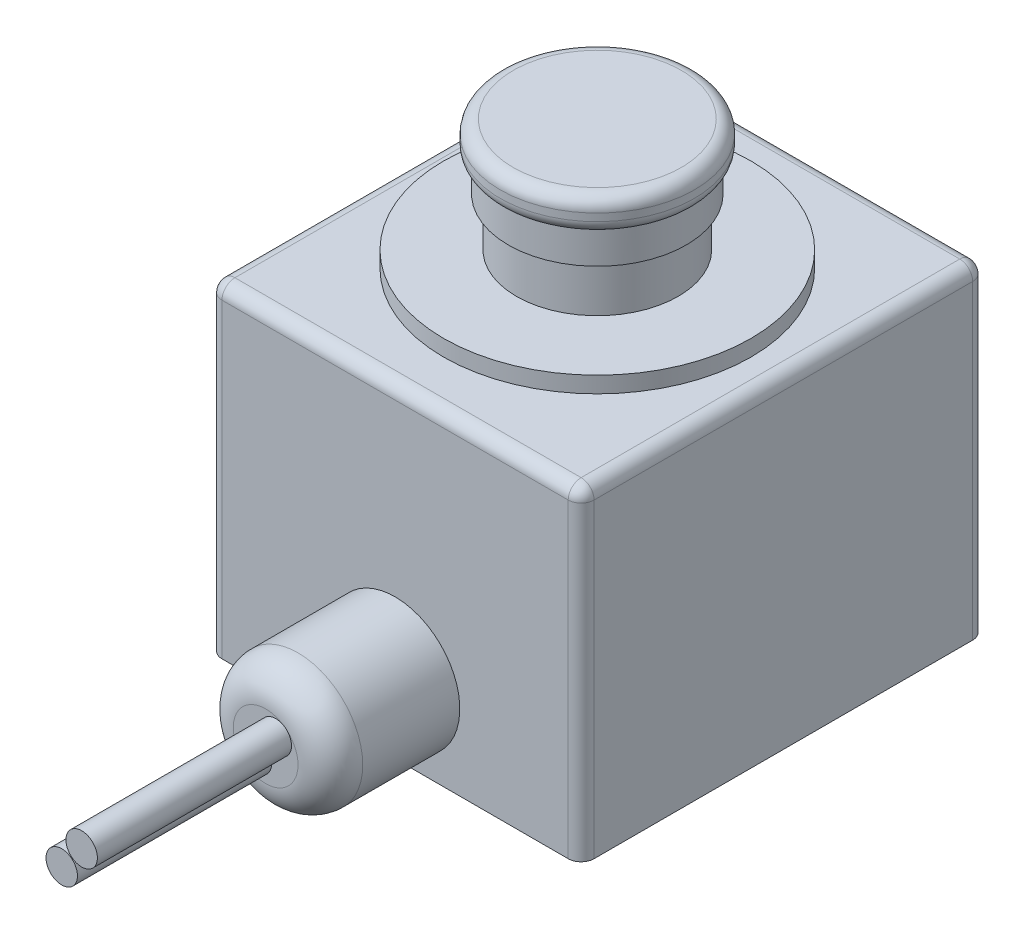
ISO-10303-21;
HEADER;
FILE_DESCRIPTION(('STEP AP214'),'2;1');
FILE_NAME('part.step','',(''),(''),'','','');
FILE_SCHEMA(('AUTOMOTIVE_DESIGN { 1 0 10303 214 1 1 1 1 }'));
ENDSEC;
DATA;
#1=APPLICATION_CONTEXT('core data for automotive mechanical design processes');
#2=APPLICATION_PROTOCOL_DEFINITION('international standard','automotive_design',2000,#1);
#3=PRODUCT_CONTEXT('',#1,'mechanical');
#4=PRODUCT('Part','Part','',(#3));
#5=PRODUCT_RELATED_PRODUCT_CATEGORY('part','',(#4));
#6=PRODUCT_DEFINITION_FORMATION('','',#4);
#7=PRODUCT_DEFINITION_CONTEXT('part definition',#1,'design');
#8=PRODUCT_DEFINITION('design','',#6,#7);
#9=PRODUCT_DEFINITION_SHAPE('','',#8);
#10=(LENGTH_UNIT() NAMED_UNIT(*) SI_UNIT(.MILLI.,.METRE.));
#11=(NAMED_UNIT(*) PLANE_ANGLE_UNIT() SI_UNIT($,.RADIAN.));
#12=(NAMED_UNIT(*) SI_UNIT($,.STERADIAN.) SOLID_ANGLE_UNIT());
#13=UNCERTAINTY_MEASURE_WITH_UNIT(LENGTH_MEASURE(1.E-05),#10,'distance_accuracy_value','');
#14=(GEOMETRIC_REPRESENTATION_CONTEXT(3) GLOBAL_UNCERTAINTY_ASSIGNED_CONTEXT((#13)) GLOBAL_UNIT_ASSIGNED_CONTEXT((#10,
#11,#12)) REPRESENTATION_CONTEXT('',''));
#15=CARTESIAN_POINT('',(0.,0.,0.));
#16=DIRECTION('',(0.,0.,1.));
#17=DIRECTION('',(1.,0.,0.));
#18=AXIS2_PLACEMENT_3D('',#15,#16,#17);
#19=CARTESIAN_POINT('',(0.,63.5,0.));
#20=DIRECTION('',(-1.,0.,0.));
#21=DIRECTION('',(0.,0.,1.));
#22=AXIS2_PLACEMENT_3D('',#19,#20,#21);
#23=PLANE('',#22);
#24=DIRECTION('',(0.,-1.,0.));
#25=VECTOR('',#24,1.);
#26=CARTESIAN_POINT('',(0.,63.5,-2.54));
#27=LINE('',#26,#25);
#28=CARTESIAN_POINT('',(0.,0.,-2.54));
#29=VERTEX_POINT('',#28);
#30=CARTESIAN_POINT('',(0.,60.96,-2.54));
#31=VERTEX_POINT('',#30);
#32=EDGE_CURVE('E209',#29,#31,#27,.F.);
#33=ORIENTED_EDGE('',*,*,#32,.T.);
#34=DIRECTION('',(0.,0.,-1.));
#35=VECTOR('',#34,1.);
#36=CARTESIAN_POINT('',(0.,60.96,-76.835));
#37=LINE('',#36,#35);
#38=CARTESIAN_POINT('',(0.,60.96,-76.835));
#39=VERTEX_POINT('',#38);
#40=EDGE_CURVE('E234',#31,#39,#37,.T.);
#41=ORIENTED_EDGE('',*,*,#40,.T.);
#42=DIRECTION('',(0.,-1.,0.));
#43=VECTOR('',#42,1.);
#44=CARTESIAN_POINT('',(0.,63.5,-76.835));
#45=LINE('',#44,#43);
#46=CARTESIAN_POINT('',(0.,0.,-76.835));
#47=VERTEX_POINT('',#46);
#48=EDGE_CURVE('E207',#39,#47,#45,.T.);
#49=ORIENTED_EDGE('',*,*,#48,.T.);
#50=DIRECTION('',(0.,0.,-1.));
#51=VECTOR('',#50,1.);
#52=CARTESIAN_POINT('',(0.,0.,0.));
#53=LINE('',#52,#51);
#54=EDGE_CURVE('E158',#29,#47,#53,.T.);
#55=ORIENTED_EDGE('',*,*,#54,.F.);
#56=EDGE_LOOP('',(#33,#41,#49,#55));
#57=FACE_BOUND('',#56,.T.);
#58=ADVANCED_FACE('F42',(#57),#23,.T.);
#59=CARTESIAN_POINT('',(0.,63.5,0.));
#60=DIRECTION('',(0.,0.,-1.));
#61=DIRECTION('',(-1.,0.,0.));
#62=AXIS2_PLACEMENT_3D('',#59,#60,#61);
#63=PLANE('',#62);
#64=CARTESIAN_POINT('',(36.5125,14.8342201045247,0.));
#65=DIRECTION('',(0.,0.,-1.));
#66=DIRECTION('',(-1.,0.,0.));
#67=AXIS2_PLACEMENT_3D('',#64,#65,#66);
#68=CIRCLE('',#67,12.7);
#69=CARTESIAN_POINT('',(23.8125,14.8342201045247,0.));
#70=VERTEX_POINT('',#69);
#71=EDGE_CURVE('E126',#70,#70,#68,.F.);
#72=ORIENTED_EDGE('',*,*,#71,.F.);
#73=EDGE_LOOP('',(#72));
#74=FACE_BOUND('',#73,.T.);
#75=DIRECTION('',(0.,-1.,0.));
#76=VECTOR('',#75,1.);
#77=CARTESIAN_POINT('',(70.485,63.5,0.));
#78=LINE('',#77,#76);
#79=CARTESIAN_POINT('',(70.485,0.,0.));
#80=VERTEX_POINT('',#79);
#81=CARTESIAN_POINT('',(70.485,60.96,0.));
#82=VERTEX_POINT('',#81);
#83=EDGE_CURVE('E204',#80,#82,#78,.F.);
#84=ORIENTED_EDGE('',*,*,#83,.T.);
#85=DIRECTION('',(1.,0.,0.));
#86=VECTOR('',#85,1.);
#87=CARTESIAN_POINT('',(0.,60.96,0.));
#88=LINE('',#87,#86);
#89=CARTESIAN_POINT('',(2.54,60.96,0.));
#90=VERTEX_POINT('',#89);
#91=EDGE_CURVE('E230',#82,#90,#88,.F.);
#92=ORIENTED_EDGE('',*,*,#91,.T.);
#93=DIRECTION('',(0.,-1.,0.));
#94=VECTOR('',#93,1.);
#95=CARTESIAN_POINT('',(2.54,0.,0.));
#96=LINE('',#95,#94);
#97=CARTESIAN_POINT('',(2.54,0.,0.));
#98=VERTEX_POINT('',#97);
#99=EDGE_CURVE('E202',#90,#98,#96,.T.);
#100=ORIENTED_EDGE('',*,*,#99,.T.);
#101=DIRECTION('',(1.,0.,0.));
#102=VECTOR('',#101,1.);
#103=CARTESIAN_POINT('',(0.,0.,0.));
#104=LINE('',#103,#102);
#105=EDGE_CURVE('E167',#98,#80,#104,.T.);
#106=ORIENTED_EDGE('',*,*,#105,.T.);
#107=EDGE_LOOP('',(#84,#92,#100,#106));
#108=FACE_BOUND('',#107,.T.);
#109=ADVANCED_FACE('F261',(#74,#108),#63,.F.);
#110=CARTESIAN_POINT('',(73.025,63.5,0.));
#111=DIRECTION('',(-1.,0.,0.));
#112=DIRECTION('',(0.,0.,1.));
#113=AXIS2_PLACEMENT_3D('',#110,#111,#112);
#114=PLANE('',#113);
#115=DIRECTION('',(0.,-1.,0.));
#116=VECTOR('',#115,1.);
#117=CARTESIAN_POINT('',(73.025,63.5,-76.835));
#118=LINE('',#117,#116);
#119=CARTESIAN_POINT('',(73.025,0.,-76.835));
#120=VERTEX_POINT('',#119);
#121=CARTESIAN_POINT('',(73.025,60.96,-76.835));
#122=VERTEX_POINT('',#121);
#123=EDGE_CURVE('E199',#120,#122,#118,.F.);
#124=ORIENTED_EDGE('',*,*,#123,.T.);
#125=DIRECTION('',(0.,0.,-1.));
#126=VECTOR('',#125,1.);
#127=CARTESIAN_POINT('',(73.025,60.96,0.));
#128=LINE('',#127,#126);
#129=CARTESIAN_POINT('',(73.025,60.96,-2.54));
#130=VERTEX_POINT('',#129);
#131=EDGE_CURVE('E228',#122,#130,#128,.F.);
#132=ORIENTED_EDGE('',*,*,#131,.T.);
#133=DIRECTION('',(0.,-1.,0.));
#134=VECTOR('',#133,1.);
#135=CARTESIAN_POINT('',(73.025,63.5,-2.54));
#136=LINE('',#135,#134);
#137=CARTESIAN_POINT('',(73.025,0.,-2.54));
#138=VERTEX_POINT('',#137);
#139=EDGE_CURVE('E197',#130,#138,#136,.T.);
#140=ORIENTED_EDGE('',*,*,#139,.T.);
#141=DIRECTION('',(0.,0.,-1.));
#142=VECTOR('',#141,1.);
#143=CARTESIAN_POINT('',(73.025,0.,0.));
#144=LINE('',#143,#142);
#145=EDGE_CURVE('E164',#138,#120,#144,.T.);
#146=ORIENTED_EDGE('',*,*,#145,.T.);
#147=EDGE_LOOP('',(#124,#132,#140,#146));
#148=FACE_BOUND('',#147,.T.);
#149=ADVANCED_FACE('F264',(#148),#114,.F.);
#150=CARTESIAN_POINT('',(0.,63.5,-79.375));
#151=DIRECTION('',(0.,0.,-1.));
#152=DIRECTION('',(-1.,0.,0.));
#153=AXIS2_PLACEMENT_3D('',#150,#151,#152);
#154=PLANE('',#153);
#155=DIRECTION('',(0.,-1.,0.));
#156=VECTOR('',#155,1.);
#157=CARTESIAN_POINT('',(2.54,63.5,-79.375));
#158=LINE('',#157,#156);
#159=CARTESIAN_POINT('',(2.54,0.,-79.375));
#160=VERTEX_POINT('',#159);
#161=CARTESIAN_POINT('',(2.54,60.96,-79.375));
#162=VERTEX_POINT('',#161);
#163=EDGE_CURVE('E184',#160,#162,#158,.F.);
#164=ORIENTED_EDGE('',*,*,#163,.T.);
#165=DIRECTION('',(1.,0.,0.));
#166=VECTOR('',#165,1.);
#167=CARTESIAN_POINT('',(70.485,60.96,-79.375));
#168=LINE('',#167,#166);
#169=CARTESIAN_POINT('',(70.485,60.96,-79.375));
#170=VERTEX_POINT('',#169);
#171=EDGE_CURVE('E232',#162,#170,#168,.T.);
#172=ORIENTED_EDGE('',*,*,#171,.T.);
#173=DIRECTION('',(0.,-1.,0.));
#174=VECTOR('',#173,1.);
#175=CARTESIAN_POINT('',(70.485,0.,-79.375));
#176=LINE('',#175,#174);
#177=CARTESIAN_POINT('',(70.485,0.,-79.375));
#178=VERTEX_POINT('',#177);
#179=EDGE_CURVE('E187',#170,#178,#176,.T.);
#180=ORIENTED_EDGE('',*,*,#179,.T.);
#181=DIRECTION('',(1.,0.,0.));
#182=VECTOR('',#181,1.);
#183=CARTESIAN_POINT('',(0.,0.,-79.375));
#184=LINE('',#183,#182);
#185=EDGE_CURVE('E161',#160,#178,#184,.T.);
#186=ORIENTED_EDGE('',*,*,#185,.F.);
#187=EDGE_LOOP('',(#164,#172,#180,#186));
#188=FACE_BOUND('',#187,.T.);
#189=ADVANCED_FACE('F303',(#188),#154,.T.);
#190=CARTESIAN_POINT('',(0.,63.5,0.));
#191=DIRECTION('',(0.,-1.,0.));
#192=DIRECTION('',(0.,0.,-1.));
#193=AXIS2_PLACEMENT_3D('',#190,#191,#192);
#194=PLANE('',#193);
#195=DIRECTION('',(1.,0.,0.));
#196=VECTOR('',#195,1.);
#197=CARTESIAN_POINT('',(0.,63.5,-2.54));
#198=LINE('',#197,#196);
#199=CARTESIAN_POINT('',(2.54,63.5,-2.54));
#200=VERTEX_POINT('',#199);
#201=CARTESIAN_POINT('',(70.485,63.5,-2.54));
#202=VERTEX_POINT('',#201);
#203=EDGE_CURVE('E64',#200,#202,#198,.T.);
#204=ORIENTED_EDGE('',*,*,#203,.T.);
#205=DIRECTION('',(0.,0.,-1.));
#206=VECTOR('',#205,1.);
#207=CARTESIAN_POINT('',(70.485,63.5,0.));
#208=LINE('',#207,#206);
#209=CARTESIAN_POINT('',(70.485,63.5,-76.835));
#210=VERTEX_POINT('',#209);
#211=EDGE_CURVE('E226',#202,#210,#208,.T.);
#212=ORIENTED_EDGE('',*,*,#211,.T.);
#213=DIRECTION('',(1.,0.,0.));
#214=VECTOR('',#213,1.);
#215=CARTESIAN_POINT('',(2.54,63.5,-76.835));
#216=LINE('',#215,#214);
#217=CARTESIAN_POINT('',(2.54,63.5,-76.835));
#218=VERTEX_POINT('',#217);
#219=EDGE_CURVE('E223',#210,#218,#216,.F.);
#220=ORIENTED_EDGE('',*,*,#219,.T.);
#221=DIRECTION('',(0.,0.,-1.));
#222=VECTOR('',#221,1.);
#223=CARTESIAN_POINT('',(2.54,63.5,-2.54));
#224=LINE('',#223,#222);
#225=EDGE_CURVE('E221',#218,#200,#224,.F.);
#226=ORIENTED_EDGE('',*,*,#225,.T.);
#227=EDGE_LOOP('',(#204,#212,#220,#226));
#228=FACE_BOUND('',#227,.T.);
#229=CARTESIAN_POINT('',(36.5125,63.5,-39.6875));
#230=DIRECTION('',(0.,-1.,0.));
#231=DIRECTION('',(0.,0.,-1.));
#232=AXIS2_PLACEMENT_3D('',#229,#230,#231);
#233=CIRCLE('',#232,30.1625);
#234=CARTESIAN_POINT('',(36.5125,63.5,-69.85));
#235=VERTEX_POINT('',#234);
#236=EDGE_CURVE('E170',#235,#235,#233,.F.);
#237=ORIENTED_EDGE('',*,*,#236,.F.);
#238=EDGE_LOOP('',(#237));
#239=FACE_BOUND('',#238,.T.);
#240=ADVANCED_FACE('F285',(#228,#239),#194,.F.);
#241=CARTESIAN_POINT('',(0.,0.,0.));
#242=DIRECTION('',(0.,-1.,0.));
#243=DIRECTION('',(0.,0.,-1.));
#244=AXIS2_PLACEMENT_3D('',#241,#242,#243);
#245=PLANE('',#244);
#246=ORIENTED_EDGE('',*,*,#185,.T.);
#247=CARTESIAN_POINT('',(70.485,0.,-76.835));
#248=DIRECTION('',(0.,-1.,0.));
#249=DIRECTION('',(0.,0.,-1.));
#250=AXIS2_PLACEMENT_3D('',#247,#248,#249);
#251=CIRCLE('',#250,2.54);
#252=EDGE_CURVE('E195',#178,#120,#251,.T.);
#253=ORIENTED_EDGE('',*,*,#252,.T.);
#254=ORIENTED_EDGE('',*,*,#145,.F.);
#255=CARTESIAN_POINT('',(70.485,0.,-2.54));
#256=DIRECTION('',(0.,-1.,0.));
#257=DIRECTION('',(0.,0.,-1.));
#258=AXIS2_PLACEMENT_3D('',#255,#256,#257);
#259=CIRCLE('',#258,2.54);
#260=EDGE_CURVE('E193',#138,#80,#259,.T.);
#261=ORIENTED_EDGE('',*,*,#260,.T.);
#262=ORIENTED_EDGE('',*,*,#105,.F.);
#263=CARTESIAN_POINT('',(2.54,0.,-2.54));
#264=DIRECTION('',(0.,-1.,0.));
#265=DIRECTION('',(0.,0.,-1.));
#266=AXIS2_PLACEMENT_3D('',#263,#264,#265);
#267=CIRCLE('',#266,2.54);
#268=EDGE_CURVE('E191',#98,#29,#267,.T.);
#269=ORIENTED_EDGE('',*,*,#268,.T.);
#270=ORIENTED_EDGE('',*,*,#54,.T.);
#271=CARTESIAN_POINT('',(2.54,0.,-76.835));
#272=DIRECTION('',(0.,-1.,0.));
#273=DIRECTION('',(0.,0.,-1.));
#274=AXIS2_PLACEMENT_3D('',#271,#272,#273);
#275=CIRCLE('',#274,2.54);
#276=EDGE_CURVE('E189',#47,#160,#275,.T.);
#277=ORIENTED_EDGE('',*,*,#276,.T.);
#278=EDGE_LOOP('',(#246,#253,#254,#261,#262,#269,#270,#277));
#279=FACE_BOUND('',#278,.T.);
#280=ADVANCED_FACE('F318',(#279),#245,.T.);
#281=CARTESIAN_POINT('',(36.5125,66.675,-39.6875));
#282=DIRECTION('',(0.,-1.,0.));
#283=DIRECTION('',(0.,0.,-1.));
#284=AXIS2_PLACEMENT_3D('',#281,#282,#283);
#285=CYLINDRICAL_SURFACE('',#284,30.1625);
#286=CARTESIAN_POINT('',(36.5125,66.675,-39.6875));
#287=DIRECTION('',(0.,1.,0.));
#288=DIRECTION('',(0.,0.,1.));
#289=AXIS2_PLACEMENT_3D('',#286,#287,#288);
#290=CIRCLE('',#289,30.1625);
#291=CARTESIAN_POINT('',(36.5125,66.675,-9.52499999999998));
#292=VERTEX_POINT('',#291);
#293=EDGE_CURVE('E147',#292,#292,#290,.T.);
#294=ORIENTED_EDGE('',*,*,#293,.F.);
#295=EDGE_LOOP('',(#294));
#296=FACE_BOUND('',#295,.T.);
#297=ORIENTED_EDGE('',*,*,#236,.T.);
#298=EDGE_LOOP('',(#297));
#299=FACE_BOUND('',#298,.T.);
#300=ADVANCED_FACE('F453',(#296,#299),#285,.T.);
#301=CARTESIAN_POINT('',(36.5125,66.675,-39.6875));
#302=DIRECTION('',(0.,1.,0.));
#303=DIRECTION('',(0.,0.,1.));
#304=AXIS2_PLACEMENT_3D('',#301,#302,#303);
#305=PLANE('',#304);
#306=CARTESIAN_POINT('',(36.5125,66.675,-39.6875));
#307=DIRECTION('',(0.,1.,0.));
#308=DIRECTION('',(0.,0.,1.));
#309=AXIS2_PLACEMENT_3D('',#306,#307,#308);
#310=CIRCLE('',#309,15.875);
#311=CARTESIAN_POINT('',(36.5125,66.675,-23.8125));
#312=VERTEX_POINT('',#311);
#313=EDGE_CURVE('E154',#312,#312,#310,.T.);
#314=ORIENTED_EDGE('',*,*,#313,.F.);
#315=EDGE_LOOP('',(#314));
#316=FACE_BOUND('',#315,.T.);
#317=ORIENTED_EDGE('',*,*,#293,.T.);
#318=EDGE_LOOP('',(#317));
#319=FACE_BOUND('',#318,.T.);
#320=ADVANCED_FACE('F582',(#316,#319),#305,.T.);
#321=CARTESIAN_POINT('',(36.5125,76.2,-39.6875));
#322=DIRECTION('',(0.,-1.,0.));
#323=DIRECTION('',(0.,0.,-1.));
#324=AXIS2_PLACEMENT_3D('',#321,#322,#323);
#325=CYLINDRICAL_SURFACE('',#324,15.875);
#326=ORIENTED_EDGE('',*,*,#313,.T.);
#327=EDGE_LOOP('',(#326));
#328=FACE_BOUND('',#327,.T.);
#329=CARTESIAN_POINT('',(36.5125,76.2,-39.6875));
#330=DIRECTION('',(0.,1.,0.));
#331=DIRECTION('',(0.,0.,1.));
#332=AXIS2_PLACEMENT_3D('',#329,#330,#331);
#333=CIRCLE('',#332,15.875);
#334=CARTESIAN_POINT('',(36.5125,76.2,-23.8125));
#335=VERTEX_POINT('',#334);
#336=EDGE_CURVE('E155',#335,#335,#333,.T.);
#337=ORIENTED_EDGE('',*,*,#336,.F.);
#338=EDGE_LOOP('',(#337));
#339=FACE_BOUND('',#338,.T.);
#340=ADVANCED_FACE('F580',(#328,#339),#325,.T.);
#341=CARTESIAN_POINT('',(36.5125,82.55,-39.6875));
#342=DIRECTION('',(0.,-1.,0.));
#343=DIRECTION('',(0.,0.,-1.));
#344=AXIS2_PLACEMENT_3D('',#341,#342,#343);
#345=CYLINDRICAL_SURFACE('',#344,17.4625);
#346=CARTESIAN_POINT('',(36.5125,82.55,-39.6875));
#347=DIRECTION('',(0.,1.,0.));
#348=DIRECTION('',(0.,0.,1.));
#349=AXIS2_PLACEMENT_3D('',#346,#347,#348);
#350=CIRCLE('',#349,17.4625);
#351=CARTESIAN_POINT('',(36.5125,82.55,-22.225));
#352=VERTEX_POINT('',#351);
#353=EDGE_CURVE('E144',#352,#352,#350,.T.);
#354=ORIENTED_EDGE('',*,*,#353,.F.);
#355=EDGE_LOOP('',(#354));
#356=FACE_BOUND('',#355,.T.);
#357=CARTESIAN_POINT('',(36.5125,76.2,-39.6875));
#358=DIRECTION('',(0.,1.,0.));
#359=DIRECTION('',(0.,0.,1.));
#360=AXIS2_PLACEMENT_3D('',#357,#358,#359);
#361=CIRCLE('',#360,17.4625);
#362=CARTESIAN_POINT('',(36.5125,76.2,-22.225));
#363=VERTEX_POINT('',#362);
#364=EDGE_CURVE('E148',#363,#363,#361,.T.);
#365=ORIENTED_EDGE('',*,*,#364,.T.);
#366=EDGE_LOOP('',(#365));
#367=FACE_BOUND('',#366,.T.);
#368=ADVANCED_FACE('F576',(#356,#367),#345,.T.);
#369=CARTESIAN_POINT('',(36.5125,76.2,-39.6875));
#370=DIRECTION('',(0.,1.,0.));
#371=DIRECTION('',(0.,0.,1.));
#372=AXIS2_PLACEMENT_3D('',#369,#370,#371);
#373=PLANE('',#372);
#374=ORIENTED_EDGE('',*,*,#336,.T.);
#375=EDGE_LOOP('',(#374));
#376=FACE_BOUND('',#375,.T.);
#377=ORIENTED_EDGE('',*,*,#364,.F.);
#378=EDGE_LOOP('',(#377));
#379=FACE_BOUND('',#378,.T.);
#380=ADVANCED_FACE('F572',(#376,#379),#373,.F.);
#381=CARTESIAN_POINT('',(36.5125,88.9,-39.6875));
#382=DIRECTION('',(0.,-1.,0.));
#383=DIRECTION('',(0.,0.,-1.));
#384=AXIS2_PLACEMENT_3D('',#381,#382,#383);
#385=CYLINDRICAL_SURFACE('',#384,19.05);
#386=CARTESIAN_POINT('',(36.5125,84.9046430196529,-39.6875));
#387=DIRECTION('',(0.,-1.,0.));
#388=DIRECTION('',(0.,0.,-1.));
#389=AXIS2_PLACEMENT_3D('',#386,#387,#388);
#390=CIRCLE('',#389,19.05);
#391=CARTESIAN_POINT('',(36.5125,84.9046430196529,-58.7375));
#392=VERTEX_POINT('',#391);
#393=EDGE_CURVE('E178',#392,#392,#390,.F.);
#394=ORIENTED_EDGE('',*,*,#393,.T.);
#395=EDGE_LOOP('',(#394));
#396=FACE_BOUND('',#395,.T.);
#397=CARTESIAN_POINT('',(36.5125,86.36,-39.6875));
#398=DIRECTION('',(0.,1.,0.));
#399=DIRECTION('',(0.,0.,1.));
#400=AXIS2_PLACEMENT_3D('',#397,#398,#399);
#401=CIRCLE('',#400,19.05);
#402=CARTESIAN_POINT('',(36.5125,86.36,-20.6375));
#403=VERTEX_POINT('',#402);
#404=EDGE_CURVE('E175',#403,#403,#401,.F.);
#405=ORIENTED_EDGE('',*,*,#404,.T.);
#406=EDGE_LOOP('',(#405));
#407=FACE_BOUND('',#406,.T.);
#408=ADVANCED_FACE('F568',(#396,#407),#385,.T.);
#409=CARTESIAN_POINT('',(36.5125,88.9,-39.6875));
#410=DIRECTION('',(0.,1.,0.));
#411=DIRECTION('',(0.,0.,1.));
#412=AXIS2_PLACEMENT_3D('',#409,#410,#411);
#413=PLANE('',#412);
#414=CARTESIAN_POINT('',(36.5125,88.9,-39.6875));
#415=DIRECTION('',(0.,1.,0.));
#416=DIRECTION('',(0.,0.,1.));
#417=AXIS2_PLACEMENT_3D('',#414,#415,#416);
#418=CIRCLE('',#417,16.51);
#419=CARTESIAN_POINT('',(36.5125,88.9,-23.1775));
#420=VERTEX_POINT('',#419);
#421=EDGE_CURVE('E181',#420,#420,#418,.T.);
#422=ORIENTED_EDGE('',*,*,#421,.T.);
#423=EDGE_LOOP('',(#422));
#424=FACE_BOUND('',#423,.T.);
#425=ADVANCED_FACE('F351',(#424),#413,.T.);
#426=CARTESIAN_POINT('',(36.5125,84.9046430196529,-39.6875));
#427=DIRECTION('',(0.,-1.,0.));
#428=DIRECTION('',(0.,0.,-1.));
#429=AXIS2_PLACEMENT_3D('',#426,#427,#428);
#430=TOROIDAL_SURFACE('',#429,16.51,2.54);
#431=ORIENTED_EDGE('',*,*,#353,.T.);
#432=EDGE_LOOP('',(#431));
#433=FACE_BOUND('',#432,.T.);
#434=ORIENTED_EDGE('',*,*,#393,.F.);
#435=EDGE_LOOP('',(#434));
#436=FACE_BOUND('',#435,.T.);
#437=ADVANCED_FACE('F347',(#433,#436),#430,.T.);
#438=CARTESIAN_POINT('',(36.5125,86.36,-39.6875));
#439=DIRECTION('',(0.,1.,0.));
#440=DIRECTION('',(0.,0.,1.));
#441=AXIS2_PLACEMENT_3D('',#438,#439,#440);
#442=TOROIDAL_SURFACE('',#441,16.51,2.54);
#443=ORIENTED_EDGE('',*,*,#404,.F.);
#444=EDGE_LOOP('',(#443));
#445=FACE_BOUND('',#444,.T.);
#446=ORIENTED_EDGE('',*,*,#421,.F.);
#447=EDGE_LOOP('',(#446));
#448=FACE_BOUND('',#447,.T.);
#449=ADVANCED_FACE('F350',(#445,#448),#442,.T.);
#450=CARTESIAN_POINT('',(70.485,63.5,-76.835));
#451=DIRECTION('',(0.,1.,0.));
#452=DIRECTION('',(0.,0.,1.));
#453=AXIS2_PLACEMENT_3D('',#450,#451,#452);
#454=CYLINDRICAL_SURFACE('',#453,2.54);
#455=ORIENTED_EDGE('',*,*,#179,.F.);
#456=CARTESIAN_POINT('',(70.485,60.96,-76.835));
#457=DIRECTION('',(0.,1.,0.));
#458=DIRECTION('',(0.,0.,1.));
#459=AXIS2_PLACEMENT_3D('',#456,#457,#458);
#460=CIRCLE('',#459,2.54);
#461=EDGE_CURVE('E212',#170,#122,#460,.F.);
#462=ORIENTED_EDGE('',*,*,#461,.T.);
#463=ORIENTED_EDGE('',*,*,#123,.F.);
#464=ORIENTED_EDGE('',*,*,#252,.F.);
#465=EDGE_LOOP('',(#455,#462,#463,#464));
#466=FACE_BOUND('',#465,.T.);
#467=ADVANCED_FACE('F309',(#466),#454,.T.);
#468=CARTESIAN_POINT('',(70.485,63.5,-2.54));
#469=DIRECTION('',(0.,-1.,0.));
#470=DIRECTION('',(0.,0.,-1.));
#471=AXIS2_PLACEMENT_3D('',#468,#469,#470);
#472=CYLINDRICAL_SURFACE('',#471,2.54);
#473=ORIENTED_EDGE('',*,*,#139,.F.);
#474=CARTESIAN_POINT('',(70.485,60.96,-2.54));
#475=DIRECTION('',(0.,-1.,0.));
#476=DIRECTION('',(0.,0.,-1.));
#477=AXIS2_PLACEMENT_3D('',#474,#475,#476);
#478=CIRCLE('',#477,2.54);
#479=EDGE_CURVE('E219',#130,#82,#478,.T.);
#480=ORIENTED_EDGE('',*,*,#479,.T.);
#481=ORIENTED_EDGE('',*,*,#83,.F.);
#482=ORIENTED_EDGE('',*,*,#260,.F.);
#483=EDGE_LOOP('',(#473,#480,#481,#482));
#484=FACE_BOUND('',#483,.T.);
#485=ADVANCED_FACE('F315',(#484),#472,.T.);
#486=CARTESIAN_POINT('',(2.54,63.5,-2.54));
#487=DIRECTION('',(0.,1.,0.));
#488=DIRECTION('',(0.,0.,1.));
#489=AXIS2_PLACEMENT_3D('',#486,#487,#488);
#490=CYLINDRICAL_SURFACE('',#489,2.54);
#491=ORIENTED_EDGE('',*,*,#99,.F.);
#492=CARTESIAN_POINT('',(2.54,60.96,-2.54));
#493=DIRECTION('',(0.,1.,0.));
#494=DIRECTION('',(0.,0.,1.));
#495=AXIS2_PLACEMENT_3D('',#492,#493,#494);
#496=CIRCLE('',#495,2.54);
#497=EDGE_CURVE('E217',#90,#31,#496,.F.);
#498=ORIENTED_EDGE('',*,*,#497,.T.);
#499=ORIENTED_EDGE('',*,*,#32,.F.);
#500=ORIENTED_EDGE('',*,*,#268,.F.);
#501=EDGE_LOOP('',(#491,#498,#499,#500));
#502=FACE_BOUND('',#501,.T.);
#503=ADVANCED_FACE('F331',(#502),#490,.T.);
#504=CARTESIAN_POINT('',(2.54,63.5,-76.835));
#505=DIRECTION('',(0.,-1.,0.));
#506=DIRECTION('',(0.,0.,-1.));
#507=AXIS2_PLACEMENT_3D('',#504,#505,#506);
#508=CYLINDRICAL_SURFACE('',#507,2.54);
#509=ORIENTED_EDGE('',*,*,#48,.F.);
#510=CARTESIAN_POINT('',(2.54,60.96,-76.835));
#511=DIRECTION('',(0.,-1.,0.));
#512=DIRECTION('',(0.,0.,-1.));
#513=AXIS2_PLACEMENT_3D('',#510,#511,#512);
#514=CIRCLE('',#513,2.54);
#515=EDGE_CURVE('E215',#39,#162,#514,.T.);
#516=ORIENTED_EDGE('',*,*,#515,.T.);
#517=ORIENTED_EDGE('',*,*,#163,.F.);
#518=ORIENTED_EDGE('',*,*,#276,.F.);
#519=EDGE_LOOP('',(#509,#516,#517,#518));
#520=FACE_BOUND('',#519,.T.);
#521=ADVANCED_FACE('F322',(#520),#508,.T.);
#522=CARTESIAN_POINT('',(2.54,60.96,-2.54));
#523=DIRECTION('',(0.,-1.,0.));
#524=DIRECTION('',(0.,0.,-1.));
#525=AXIS2_PLACEMENT_3D('',#522,#523,#524);
#526=SPHERICAL_SURFACE('',#525,2.54);
#527=CARTESIAN_POINT('',(2.54,60.96,-2.54));
#528=DIRECTION('',(0.,0.,-1.));
#529=DIRECTION('',(-1.,0.,0.));
#530=AXIS2_PLACEMENT_3D('',#527,#528,#529);
#531=CIRCLE('',#530,2.54);
#532=EDGE_CURVE('E251',#31,#200,#531,.T.);
#533=ORIENTED_EDGE('',*,*,#532,.F.);
#534=ORIENTED_EDGE('',*,*,#497,.F.);
#535=CARTESIAN_POINT('',(2.54,60.96,-2.54));
#536=DIRECTION('',(1.,0.,0.));
#537=DIRECTION('',(0.,0.,-1.));
#538=AXIS2_PLACEMENT_3D('',#535,#536,#537);
#539=CIRCLE('',#538,2.54);
#540=EDGE_CURVE('E151',#200,#90,#539,.T.);
#541=ORIENTED_EDGE('',*,*,#540,.F.);
#542=EDGE_LOOP('',(#533,#534,#541));
#543=FACE_BOUND('',#542,.T.);
#544=ADVANCED_FACE('F330',(#543),#526,.T.);
#545=CARTESIAN_POINT('',(0.,60.96,-2.54));
#546=DIRECTION('',(1.,0.,0.));
#547=DIRECTION('',(0.,0.,-1.));
#548=AXIS2_PLACEMENT_3D('',#545,#546,#547);
#549=CYLINDRICAL_SURFACE('',#548,2.54);
#550=ORIENTED_EDGE('',*,*,#540,.T.);
#551=ORIENTED_EDGE('',*,*,#91,.F.);
#552=CARTESIAN_POINT('',(70.485,60.96,-2.54));
#553=DIRECTION('',(1.,0.,0.));
#554=DIRECTION('',(0.,0.,-1.));
#555=AXIS2_PLACEMENT_3D('',#552,#553,#554);
#556=CIRCLE('',#555,2.54);
#557=EDGE_CURVE('E248',#202,#82,#556,.T.);
#558=ORIENTED_EDGE('',*,*,#557,.F.);
#559=ORIENTED_EDGE('',*,*,#203,.F.);
#560=EDGE_LOOP('',(#550,#551,#558,#559));
#561=FACE_BOUND('',#560,.T.);
#562=ADVANCED_FACE('F273',(#561),#549,.T.);
#563=CARTESIAN_POINT('',(2.54,60.96,0.));
#564=DIRECTION('',(0.,0.,1.));
#565=DIRECTION('',(1.,0.,0.));
#566=AXIS2_PLACEMENT_3D('',#563,#564,#565);
#567=CYLINDRICAL_SURFACE('',#566,2.54);
#568=ORIENTED_EDGE('',*,*,#532,.T.);
#569=ORIENTED_EDGE('',*,*,#225,.F.);
#570=CARTESIAN_POINT('',(2.54,60.96,-76.835));
#571=DIRECTION('',(0.,0.,-1.));
#572=DIRECTION('',(-1.,0.,0.));
#573=AXIS2_PLACEMENT_3D('',#570,#571,#572);
#574=CIRCLE('',#573,2.54);
#575=EDGE_CURVE('E245',#39,#218,#574,.T.);
#576=ORIENTED_EDGE('',*,*,#575,.F.);
#577=ORIENTED_EDGE('',*,*,#40,.F.);
#578=EDGE_LOOP('',(#568,#569,#576,#577));
#579=FACE_BOUND('',#578,.T.);
#580=ADVANCED_FACE('F292',(#579),#567,.T.);
#581=CARTESIAN_POINT('',(70.485,60.96,-2.54));
#582=DIRECTION('',(0.,-1.,0.));
#583=DIRECTION('',(0.,0.,-1.));
#584=AXIS2_PLACEMENT_3D('',#581,#582,#583);
#585=SPHERICAL_SURFACE('',#584,2.54);
#586=ORIENTED_EDGE('',*,*,#557,.T.);
#587=ORIENTED_EDGE('',*,*,#479,.F.);
#588=CARTESIAN_POINT('',(70.485,60.96,-2.54));
#589=DIRECTION('',(0.,0.,-1.));
#590=DIRECTION('',(-1.,0.,0.));
#591=AXIS2_PLACEMENT_3D('',#588,#589,#590);
#592=CIRCLE('',#591,2.54);
#593=EDGE_CURVE('E242',#202,#130,#592,.T.);
#594=ORIENTED_EDGE('',*,*,#593,.F.);
#595=EDGE_LOOP('',(#586,#587,#594));
#596=FACE_BOUND('',#595,.T.);
#597=ADVANCED_FACE('F278',(#596),#585,.T.);
#598=CARTESIAN_POINT('',(2.54,60.96,-76.835));
#599=DIRECTION('',(0.,-1.,0.));
#600=DIRECTION('',(0.,0.,-1.));
#601=AXIS2_PLACEMENT_3D('',#598,#599,#600);
#602=SPHERICAL_SURFACE('',#601,2.54);
#603=ORIENTED_EDGE('',*,*,#515,.F.);
#604=ORIENTED_EDGE('',*,*,#575,.T.);
#605=CARTESIAN_POINT('',(2.54,60.96,-76.835));
#606=DIRECTION('',(1.,0.,0.));
#607=DIRECTION('',(0.,0.,-1.));
#608=AXIS2_PLACEMENT_3D('',#605,#606,#607);
#609=CIRCLE('',#608,2.54);
#610=EDGE_CURVE('E239',#162,#218,#609,.T.);
#611=ORIENTED_EDGE('',*,*,#610,.F.);
#612=EDGE_LOOP('',(#603,#604,#611));
#613=FACE_BOUND('',#612,.T.);
#614=ADVANCED_FACE('F298',(#613),#602,.T.);
#615=CARTESIAN_POINT('',(70.485,60.96,0.));
#616=DIRECTION('',(0.,0.,-1.));
#617=DIRECTION('',(-1.,0.,0.));
#618=AXIS2_PLACEMENT_3D('',#615,#616,#617);
#619=CYLINDRICAL_SURFACE('',#618,2.54);
#620=ORIENTED_EDGE('',*,*,#593,.T.);
#621=ORIENTED_EDGE('',*,*,#131,.F.);
#622=CARTESIAN_POINT('',(70.485,60.96,-76.835));
#623=DIRECTION('',(0.,0.,-1.));
#624=DIRECTION('',(-1.,0.,0.));
#625=AXIS2_PLACEMENT_3D('',#622,#623,#624);
#626=CIRCLE('',#625,2.54);
#627=EDGE_CURVE('E237',#210,#122,#626,.T.);
#628=ORIENTED_EDGE('',*,*,#627,.F.);
#629=ORIENTED_EDGE('',*,*,#211,.F.);
#630=EDGE_LOOP('',(#620,#621,#628,#629));
#631=FACE_BOUND('',#630,.T.);
#632=ADVANCED_FACE('F283',(#631),#619,.T.);
#633=CARTESIAN_POINT('',(0.,60.96,-76.835));
#634=DIRECTION('',(-1.,0.,0.));
#635=DIRECTION('',(0.,0.,1.));
#636=AXIS2_PLACEMENT_3D('',#633,#634,#635);
#637=CYLINDRICAL_SURFACE('',#636,2.54);
#638=ORIENTED_EDGE('',*,*,#610,.T.);
#639=ORIENTED_EDGE('',*,*,#219,.F.);
#640=CARTESIAN_POINT('',(70.485,60.96,-76.835));
#641=DIRECTION('',(1.,0.,0.));
#642=DIRECTION('',(0.,0.,-1.));
#643=AXIS2_PLACEMENT_3D('',#640,#641,#642);
#644=CIRCLE('',#643,2.54);
#645=EDGE_CURVE('E140',#170,#210,#644,.T.);
#646=ORIENTED_EDGE('',*,*,#645,.F.);
#647=ORIENTED_EDGE('',*,*,#171,.F.);
#648=EDGE_LOOP('',(#638,#639,#646,#647));
#649=FACE_BOUND('',#648,.T.);
#650=ADVANCED_FACE('F300',(#649),#637,.T.);
#651=CARTESIAN_POINT('',(70.485,60.96,-76.835));
#652=DIRECTION('',(0.,-1.,0.));
#653=DIRECTION('',(0.,0.,-1.));
#654=AXIS2_PLACEMENT_3D('',#651,#652,#653);
#655=SPHERICAL_SURFACE('',#654,2.54);
#656=ORIENTED_EDGE('',*,*,#627,.T.);
#657=ORIENTED_EDGE('',*,*,#461,.F.);
#658=ORIENTED_EDGE('',*,*,#645,.T.);
#659=EDGE_LOOP('',(#656,#657,#658));
#660=FACE_BOUND('',#659,.T.);
#661=ADVANCED_FACE('F312',(#660),#655,.T.);
#662=CARTESIAN_POINT('',(36.5125,14.8342201045247,25.4));
#663=DIRECTION('',(0.,0.,-1.));
#664=DIRECTION('',(-1.,0.,0.));
#665=AXIS2_PLACEMENT_3D('',#662,#663,#664);
#666=CYLINDRICAL_SURFACE('',#665,12.7);
#667=CARTESIAN_POINT('',(36.5125,14.8342201045247,19.05));
#668=DIRECTION('',(0.,0.,1.));
#669=DIRECTION('',(1.,0.,0.));
#670=AXIS2_PLACEMENT_3D('',#667,#668,#669);
#671=CIRCLE('',#670,12.7);
#672=CARTESIAN_POINT('',(49.2125,14.8342201045247,19.05));
#673=VERTEX_POINT('',#672);
#674=EDGE_CURVE('E11',#673,#673,#671,.F.);
#675=ORIENTED_EDGE('',*,*,#674,.T.);
#676=EDGE_LOOP('',(#675));
#677=FACE_BOUND('',#676,.T.);
#678=ORIENTED_EDGE('',*,*,#71,.T.);
#679=EDGE_LOOP('',(#678));
#680=FACE_BOUND('',#679,.T.);
#681=ADVANCED_FACE('F259',(#677,#680),#666,.T.);
#682=CARTESIAN_POINT('',(36.5125,14.8342201045247,25.4));
#683=DIRECTION('',(0.,0.,1.));
#684=DIRECTION('',(1.,0.,0.));
#685=AXIS2_PLACEMENT_3D('',#682,#683,#684);
#686=PLANE('',#685);
#687=CARTESIAN_POINT('',(34.5961397962456,12.4290513241988,25.4));
#688=DIRECTION('',(0.,0.,1.));
#689=DIRECTION('',(1.,0.,0.));
#690=AXIS2_PLACEMENT_3D('',#687,#688,#689);
#691=CIRCLE('',#690,3.08635145794747);
#692=CARTESIAN_POINT('',(31.5097883382981,12.4290513241988,25.4));
#693=VERTEX_POINT('',#692);
#694=EDGE_CURVE('E735',#693,#693,#691,.T.);
#695=ORIENTED_EDGE('',*,*,#694,.F.);
#696=EDGE_LOOP('',(#695));
#697=FACE_BOUND('',#696,.T.);
#698=CARTESIAN_POINT('',(36.5125,14.8342201045247,25.4));
#699=DIRECTION('',(0.,0.,1.));
#700=DIRECTION('',(1.,0.,0.));
#701=AXIS2_PLACEMENT_3D('',#698,#699,#700);
#702=CIRCLE('',#701,6.35);
#703=CARTESIAN_POINT('',(39.997411989931,20.142504989724,25.4));
#704=VERTEX_POINT('',#703);
#705=CARTESIAN_POINT('',(40.7237191792844,19.5869175516622,25.4));
#706=VERTEX_POINT('',#705);
#707=EDGE_CURVE('E56',#704,#706,#702,.T.);
#708=ORIENTED_EDGE('',*,*,#707,.T.);
#709=CARTESIAN_POINT('',(38.5060768011583,17.4403790347207,25.4));
#710=DIRECTION('',(0.,0.,1.));
#711=DIRECTION('',(1.,0.,0.));
#712=AXIS2_PLACEMENT_3D('',#709,#710,#711);
#713=CIRCLE('',#712,3.08635145794747);
#714=EDGE_CURVE('E127',#704,#706,#713,.T.);
#715=ORIENTED_EDGE('',*,*,#714,.F.);
#716=EDGE_LOOP('',(#708,#715));
#717=FACE_BOUND('',#716,.T.);
#718=ADVANCED_FACE('F128',(#697,#717),#686,.T.);
#719=CARTESIAN_POINT('',(36.5125,14.8342201045247,19.05));
#720=DIRECTION('',(0.,0.,1.));
#721=DIRECTION('',(1.,0.,0.));
#722=AXIS2_PLACEMENT_3D('',#719,#720,#721);
#723=TOROIDAL_SURFACE('',#722,6.35,6.35);
#724=ORIENTED_EDGE('',*,*,#674,.F.);
#725=EDGE_LOOP('',(#724));
#726=FACE_BOUND('',#725,.T.);
#727=EDGE_CURVE('E50',#706,#704,#702,.T.);
#728=ORIENTED_EDGE('',*,*,#727,.F.);
#729=ORIENTED_EDGE('',*,*,#707,.F.);
#730=EDGE_LOOP('',(#728,#729));
#731=FACE_BOUND('',#730,.T.);
#732=ADVANCED_FACE('F44',(#726,#731),#723,.T.);
#733=CARTESIAN_POINT('',(38.5060768011583,17.4403790347207,63.5));
#734=DIRECTION('',(0.,0.,-1.));
#735=DIRECTION('',(-1.,0.,0.));
#736=AXIS2_PLACEMENT_3D('',#733,#734,#735);
#737=CYLINDRICAL_SURFACE('',#736,3.08635145794747);
#738=CARTESIAN_POINT('',(38.5060768011583,17.4403790347207,63.5));
#739=DIRECTION('',(0.,0.,1.));
#740=DIRECTION('',(1.,0.,0.));
#741=AXIS2_PLACEMENT_3D('',#738,#739,#740);
#742=CIRCLE('',#741,3.08635145794747);
#743=CARTESIAN_POINT('',(41.5924282591058,17.4403790347207,63.5));
#744=VERTEX_POINT('',#743);
#745=EDGE_CURVE('E138',#744,#744,#742,.T.);
#746=ORIENTED_EDGE('',*,*,#745,.F.);
#747=EDGE_LOOP('',(#746));
#748=FACE_BOUND('',#747,.T.);
#749=EDGE_CURVE('E132',#706,#704,#713,.T.);
#750=ORIENTED_EDGE('',*,*,#749,.T.);
#751=ORIENTED_EDGE('',*,*,#714,.T.);
#752=EDGE_LOOP('',(#750,#751));
#753=FACE_BOUND('',#752,.T.);
#754=ADVANCED_FACE('F137',(#748,#753),#737,.T.);
#755=CARTESIAN_POINT('',(38.5060768011583,17.4403790347207,63.5));
#756=DIRECTION('',(0.,0.,1.));
#757=DIRECTION('',(1.,0.,0.));
#758=AXIS2_PLACEMENT_3D('',#755,#756,#757);
#759=PLANE('',#758);
#760=ORIENTED_EDGE('',*,*,#745,.T.);
#761=EDGE_LOOP('',(#760));
#762=FACE_BOUND('',#761,.T.);
#763=ADVANCED_FACE('F512',(#762),#759,.T.);
#764=CARTESIAN_POINT('',(38.5060768011583,17.4403790347207,25.4));
#765=DIRECTION('',(0.,0.,1.));
#766=DIRECTION('',(1.,0.,0.));
#767=AXIS2_PLACEMENT_3D('',#764,#765,#766);
#768=PLANE('',#767);
#769=ORIENTED_EDGE('',*,*,#727,.T.);
#770=ORIENTED_EDGE('',*,*,#749,.F.);
#771=EDGE_LOOP('',(#769,#770));
#772=FACE_BOUND('',#771,.T.);
#773=ADVANCED_FACE('F136',(#772),#768,.F.);
#774=CARTESIAN_POINT('',(34.5961397962456,12.4290513241988,63.5));
#775=DIRECTION('',(0.,0.,-1.));
#776=DIRECTION('',(-1.,0.,0.));
#777=AXIS2_PLACEMENT_3D('',#774,#775,#776);
#778=CYLINDRICAL_SURFACE('',#777,3.08635145794747);
#779=CARTESIAN_POINT('',(34.5961397962456,12.4290513241988,63.5));
#780=DIRECTION('',(0.,0.,1.));
#781=DIRECTION('',(1.,0.,0.));
#782=AXIS2_PLACEMENT_3D('',#779,#780,#781);
#783=CIRCLE('',#782,3.08635145794747);
#784=CARTESIAN_POINT('',(31.5097883382981,12.4290513241988,63.5));
#785=VERTEX_POINT('',#784);
#786=EDGE_CURVE('E133',#785,#785,#783,.T.);
#787=CARTESIAN_POINT('',(31.5097883382981,12.4290513241988,63.5));
#788=CARTESIAN_POINT('',(31.5097883382981,12.4290513241988,63.103125));
#789=CARTESIAN_POINT('',(31.5097883382981,12.4290513241988,62.70625));
#790=CARTESIAN_POINT('',(31.5097883382981,12.4290513241988,61.9125));
#791=CARTESIAN_POINT('',(31.5097883382981,12.4290513241988,61.515625));
#792=CARTESIAN_POINT('',(31.5097883382981,12.4290513241988,60.721875));
#793=CARTESIAN_POINT('',(31.5097883382981,12.4290513241988,60.325));
#794=CARTESIAN_POINT('',(31.5097883382981,12.4290513241988,59.53125));
#795=CARTESIAN_POINT('',(31.5097883382981,12.4290513241988,59.134375));
#796=CARTESIAN_POINT('',(31.5097883382981,12.4290513241988,58.340625));
#797=CARTESIAN_POINT('',(31.5097883382981,12.4290513241988,57.94375));
#798=CARTESIAN_POINT('',(31.5097883382981,12.4290513241988,57.15));
#799=CARTESIAN_POINT('',(31.5097883382981,12.4290513241988,56.753125));
#800=CARTESIAN_POINT('',(31.5097883382981,12.4290513241988,55.959375));
#801=CARTESIAN_POINT('',(31.5097883382981,12.4290513241988,55.5625));
#802=CARTESIAN_POINT('',(31.5097883382981,12.4290513241988,54.76875));
#803=CARTESIAN_POINT('',(31.5097883382981,12.4290513241988,54.371875));
#804=CARTESIAN_POINT('',(31.5097883382981,12.4290513241988,53.578125));
#805=CARTESIAN_POINT('',(31.5097883382981,12.4290513241988,53.18125));
#806=CARTESIAN_POINT('',(31.5097883382981,12.4290513241988,52.3875));
#807=CARTESIAN_POINT('',(31.5097883382981,12.4290513241988,51.990625));
#808=CARTESIAN_POINT('',(31.5097883382981,12.4290513241988,51.196875));
#809=CARTESIAN_POINT('',(31.5097883382981,12.4290513241988,50.8));
#810=CARTESIAN_POINT('',(31.5097883382981,12.4290513241988,50.00625));
#811=CARTESIAN_POINT('',(31.5097883382981,12.4290513241988,49.609375));
#812=CARTESIAN_POINT('',(31.5097883382981,12.4290513241988,48.815625));
#813=CARTESIAN_POINT('',(31.5097883382981,12.4290513241988,48.41875));
#814=CARTESIAN_POINT('',(31.5097883382981,12.4290513241988,47.625));
#815=CARTESIAN_POINT('',(31.5097883382981,12.4290513241988,47.228125));
#816=CARTESIAN_POINT('',(31.5097883382981,12.4290513241988,46.434375));
#817=CARTESIAN_POINT('',(31.5097883382981,12.4290513241988,46.0375));
#818=CARTESIAN_POINT('',(31.5097883382981,12.4290513241988,45.24375));
#819=CARTESIAN_POINT('',(31.5097883382981,12.4290513241988,44.846875));
#820=CARTESIAN_POINT('',(31.5097883382981,12.4290513241988,44.053125));
#821=CARTESIAN_POINT('',(31.5097883382981,12.4290513241988,43.65625));
#822=CARTESIAN_POINT('',(31.5097883382981,12.4290513241988,42.8625));
#823=CARTESIAN_POINT('',(31.5097883382981,12.4290513241988,42.465625));
#824=CARTESIAN_POINT('',(31.5097883382981,12.4290513241988,41.671875));
#825=CARTESIAN_POINT('',(31.5097883382981,12.4290513241988,41.275));
#826=CARTESIAN_POINT('',(31.5097883382981,12.4290513241988,40.48125));
#827=CARTESIAN_POINT('',(31.5097883382981,12.4290513241988,40.084375));
#828=CARTESIAN_POINT('',(31.5097883382981,12.4290513241988,39.290625));
#829=CARTESIAN_POINT('',(31.5097883382981,12.4290513241988,38.89375));
#830=CARTESIAN_POINT('',(31.5097883382981,12.4290513241988,38.1));
#831=CARTESIAN_POINT('',(31.5097883382981,12.4290513241988,37.703125));
#832=CARTESIAN_POINT('',(31.5097883382981,12.4290513241988,36.909375));
#833=CARTESIAN_POINT('',(31.5097883382981,12.4290513241988,36.5125));
#834=CARTESIAN_POINT('',(31.5097883382981,12.4290513241988,35.71875));
#835=CARTESIAN_POINT('',(31.5097883382981,12.4290513241988,35.321875));
#836=CARTESIAN_POINT('',(31.5097883382981,12.4290513241988,34.528125));
#837=CARTESIAN_POINT('',(31.5097883382981,12.4290513241988,34.13125));
#838=CARTESIAN_POINT('',(31.5097883382981,12.4290513241988,33.3375));
#839=CARTESIAN_POINT('',(31.5097883382981,12.4290513241988,32.940625));
#840=CARTESIAN_POINT('',(31.5097883382981,12.4290513241988,32.146875));
#841=CARTESIAN_POINT('',(31.5097883382981,12.4290513241988,31.75));
#842=CARTESIAN_POINT('',(31.5097883382981,12.4290513241988,30.95625));
#843=CARTESIAN_POINT('',(31.5097883382981,12.4290513241988,30.559375));
#844=CARTESIAN_POINT('',(31.5097883382981,12.4290513241988,29.765625));
#845=CARTESIAN_POINT('',(31.5097883382981,12.4290513241988,29.36875));
#846=CARTESIAN_POINT('',(31.5097883382981,12.4290513241988,28.575));
#847=CARTESIAN_POINT('',(31.5097883382981,12.4290513241988,28.178125));
#848=CARTESIAN_POINT('',(31.5097883382981,12.4290513241988,27.384375));
#849=CARTESIAN_POINT('',(31.5097883382981,12.4290513241988,26.9875));
#850=CARTESIAN_POINT('',(31.5097883382981,12.4290513241988,26.19375));
#851=CARTESIAN_POINT('',(31.5097883382981,12.4290513241988,25.796875));
#852=CARTESIAN_POINT('',(31.5097883382981,12.4290513241988,25.4));
#853=B_SPLINE_CURVE_WITH_KNOTS('',3,(#787,#788,#789,#790,#791,#792,#793,#794,#795,#796,#797,
#798,#799,#800,#801,#802,#803,#804,#805,#806,#807,#808,#809,#810,#811,#812,#813,#814,#815,#816,
#817,#818,#819,#820,#821,#822,#823,#824,#825,#826,#827,#828,#829,#830,#831,#832,#833,#834,#835,
#836,#837,#838,#839,#840,#841,#842,#843,#844,#845,#846,#847,#848,#849,#850,#851,#852),
.UNSPECIFIED.,.F.,.F.,(4,2,2,2,2,2,2,2,2,2,2,2,2,2,2,2,2,2,2,2,2,2,2,2,2,2,2,2,2,2,2,2,4),(0.,
1.19062500000001,2.38125000000001,3.57187500000001,4.7625,5.953125,7.14375,8.334375,
9.52500000000001,10.715625,11.90625,13.096875,14.2875,15.478125,16.66875,17.859375,19.05,
20.240625,21.43125,22.621875,23.8125,25.003125,26.19375,27.384375,28.575,29.765625,30.95625,
32.146875,33.3375,34.528125,35.71875,36.909375,38.1),.UNSPECIFIED.);
#854=EDGE_CURVE('BSEAM530',#785,#693,#853,.T.);
#855=ORIENTED_EDGE('',*,*,#786,.F.);
#856=ORIENTED_EDGE('',*,*,#694,.T.);
#857=ORIENTED_EDGE('',*,*,#854,.T.);
#858=ORIENTED_EDGE('',*,*,#854,.F.);
#859=EDGE_LOOP('',(#855,#857,#856,#858));
#860=FACE_BOUND('',#859,.T.);
#861=ADVANCED_FACE('F530',(#860),#778,.T.);
#862=CARTESIAN_POINT('',(34.5961397962456,12.4290513241988,63.5));
#863=DIRECTION('',(0.,0.,1.));
#864=DIRECTION('',(1.,0.,0.));
#865=AXIS2_PLACEMENT_3D('',#862,#863,#864);
#866=PLANE('',#865);
#867=ORIENTED_EDGE('',*,*,#786,.T.);
#868=EDGE_LOOP('',(#867));
#869=FACE_BOUND('',#868,.T.);
#870=ADVANCED_FACE('F525',(#869),#866,.T.);
#871=CLOSED_SHELL('',(#58,#109,#149,#189,#240,#280,#300,#320,#340,#368,#380,#408,#425,#437,#449,
#467,#485,#503,#521,#544,#562,#580,#597,#614,#632,#650,#661,#681,#718,#732,#754,#763,#773,#861,#870));
#872=MANIFOLD_SOLID_BREP('B2',#871);
#873=ADVANCED_BREP_SHAPE_REPRESENTATION('',(#18,#872),#14);
#874=SHAPE_DEFINITION_REPRESENTATION(#9,#873);
ENDSEC;
END-ISO-10303-21;
